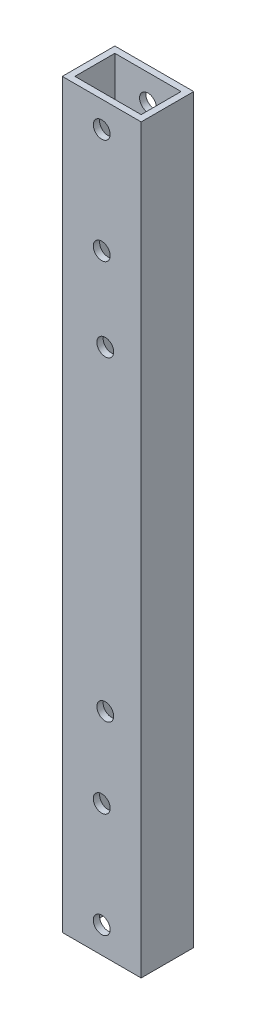
ISO-10303-21;
HEADER;
FILE_DESCRIPTION(('STEP AP214'),'2;1');
FILE_NAME('part.step','',(''),(''),'','','');
FILE_SCHEMA(('AUTOMOTIVE_DESIGN { 1 0 10303 214 1 1 1 1 }'));
ENDSEC;
DATA;
#1=APPLICATION_CONTEXT('core data for automotive mechanical design processes');
#2=APPLICATION_PROTOCOL_DEFINITION('international standard','automotive_design',2000,#1);
#3=PRODUCT_CONTEXT('',#1,'mechanical');
#4=PRODUCT('Part','Part','',(#3));
#5=PRODUCT_RELATED_PRODUCT_CATEGORY('part','',(#4));
#6=PRODUCT_DEFINITION_FORMATION('','',#4);
#7=PRODUCT_DEFINITION_CONTEXT('part definition',#1,'design');
#8=PRODUCT_DEFINITION('design','',#6,#7);
#9=PRODUCT_DEFINITION_SHAPE('','',#8);
#10=(LENGTH_UNIT() NAMED_UNIT(*) SI_UNIT(.MILLI.,.METRE.));
#11=(NAMED_UNIT(*) PLANE_ANGLE_UNIT() SI_UNIT($,.RADIAN.));
#12=(NAMED_UNIT(*) SI_UNIT($,.STERADIAN.) SOLID_ANGLE_UNIT());
#13=UNCERTAINTY_MEASURE_WITH_UNIT(LENGTH_MEASURE(1.E-05),#10,'distance_accuracy_value','');
#14=(GEOMETRIC_REPRESENTATION_CONTEXT(3) GLOBAL_UNCERTAINTY_ASSIGNED_CONTEXT((#13)) GLOBAL_UNIT_ASSIGNED_CONTEXT((#10,
#11,#12)) REPRESENTATION_CONTEXT('',''));
#15=CARTESIAN_POINT('',(0.,0.,0.));
#16=DIRECTION('',(0.,0.,1.));
#17=DIRECTION('',(1.,0.,0.));
#18=AXIS2_PLACEMENT_3D('',#15,#16,#17);
#19=CARTESIAN_POINT('',(0.,70.5,0.));
#20=DIRECTION('',(0.,1.,0.));
#21=DIRECTION('',(0.,0.,1.));
#22=AXIS2_PLACEMENT_3D('',#19,#20,#21);
#23=PLANE('',#22);
#24=DIRECTION('',(0.,0.,-1.));
#25=VECTOR('',#24,1.);
#26=CARTESIAN_POINT('',(7.5,70.5,-5.));
#27=LINE('',#26,#25);
#28=CARTESIAN_POINT('',(7.5,70.5,5.));
#29=VERTEX_POINT('',#28);
#30=CARTESIAN_POINT('',(7.5,70.5,-5.));
#31=VERTEX_POINT('',#30);
#32=EDGE_CURVE('E146',#29,#31,#27,.T.);
#33=ORIENTED_EDGE('',*,*,#32,.T.);
#34=DIRECTION('',(-1.,0.,0.));
#35=VECTOR('',#34,1.);
#36=CARTESIAN_POINT('',(-7.5,70.5,-5.));
#37=LINE('',#36,#35);
#38=CARTESIAN_POINT('',(-7.5,70.5,-5.));
#39=VERTEX_POINT('',#38);
#40=EDGE_CURVE('E149',#31,#39,#37,.T.);
#41=ORIENTED_EDGE('',*,*,#40,.T.);
#42=DIRECTION('',(0.,0.,1.));
#43=VECTOR('',#42,1.);
#44=CARTESIAN_POINT('',(-7.5,70.5,-5.));
#45=LINE('',#44,#43);
#46=CARTESIAN_POINT('',(-7.5,70.5,5.));
#47=VERTEX_POINT('',#46);
#48=EDGE_CURVE('E152',#39,#47,#45,.T.);
#49=ORIENTED_EDGE('',*,*,#48,.T.);
#50=DIRECTION('',(1.,0.,0.));
#51=VECTOR('',#50,1.);
#52=CARTESIAN_POINT('',(-7.5,70.5,5.));
#53=LINE('',#52,#51);
#54=EDGE_CURVE('E154',#47,#29,#53,.T.);
#55=ORIENTED_EDGE('',*,*,#54,.T.);
#56=EDGE_LOOP('',(#33,#41,#49,#55));
#57=FACE_BOUND('',#56,.T.);
#58=DIRECTION('',(1.,0.,0.));
#59=VECTOR('',#58,1.);
#60=CARTESIAN_POINT('',(-6.3,70.5,3.8));
#61=LINE('',#60,#59);
#62=CARTESIAN_POINT('',(-6.3,70.5,3.8));
#63=VERTEX_POINT('',#62);
#64=CARTESIAN_POINT('',(6.3,70.5,3.8));
#65=VERTEX_POINT('',#64);
#66=EDGE_CURVE('E116',#63,#65,#61,.T.);
#67=ORIENTED_EDGE('',*,*,#66,.F.);
#68=DIRECTION('',(0.,0.,1.));
#69=VECTOR('',#68,1.);
#70=CARTESIAN_POINT('',(-6.3,70.5,-3.8));
#71=LINE('',#70,#69);
#72=CARTESIAN_POINT('',(-6.3,70.5,-3.8));
#73=VERTEX_POINT('',#72);
#74=EDGE_CURVE('E108',#73,#63,#71,.T.);
#75=ORIENTED_EDGE('',*,*,#74,.F.);
#76=DIRECTION('',(-1.,0.,0.));
#77=VECTOR('',#76,1.);
#78=CARTESIAN_POINT('',(-6.3,70.5,-3.8));
#79=LINE('',#78,#77);
#80=CARTESIAN_POINT('',(6.3,70.5,-3.8));
#81=VERTEX_POINT('',#80);
#82=EDGE_CURVE('E130',#81,#73,#79,.T.);
#83=ORIENTED_EDGE('',*,*,#82,.F.);
#84=DIRECTION('',(0.,0.,-1.));
#85=VECTOR('',#84,1.);
#86=CARTESIAN_POINT('',(6.3,70.5,-3.8));
#87=LINE('',#86,#85);
#88=EDGE_CURVE('E128',#65,#81,#87,.T.);
#89=ORIENTED_EDGE('',*,*,#88,.F.);
#90=EDGE_LOOP('',(#67,#75,#83,#89));
#91=FACE_BOUND('',#90,.T.);
#92=ADVANCED_FACE('F41',(#57,#91),#23,.T.);
#93=CARTESIAN_POINT('',(0.,-70.5,0.));
#94=DIRECTION('',(0.,1.,0.));
#95=DIRECTION('',(0.,0.,1.));
#96=AXIS2_PLACEMENT_3D('',#93,#94,#95);
#97=PLANE('',#96);
#98=DIRECTION('',(0.,0.,-1.));
#99=VECTOR('',#98,1.);
#100=CARTESIAN_POINT('',(7.5,-70.5,-5.));
#101=LINE('',#100,#99);
#102=CARTESIAN_POINT('',(7.5,-70.5,5.));
#103=VERTEX_POINT('',#102);
#104=CARTESIAN_POINT('',(7.5,-70.5,-5.));
#105=VERTEX_POINT('',#104);
#106=EDGE_CURVE('E124',#103,#105,#101,.T.);
#107=ORIENTED_EDGE('',*,*,#106,.F.);
#108=DIRECTION('',(1.,0.,0.));
#109=VECTOR('',#108,1.);
#110=CARTESIAN_POINT('',(-7.5,-70.5,5.));
#111=LINE('',#110,#109);
#112=CARTESIAN_POINT('',(-7.5,-70.5,5.));
#113=VERTEX_POINT('',#112);
#114=EDGE_CURVE('E150',#113,#103,#111,.T.);
#115=ORIENTED_EDGE('',*,*,#114,.F.);
#116=DIRECTION('',(0.,0.,1.));
#117=VECTOR('',#116,1.);
#118=CARTESIAN_POINT('',(-7.5,-70.5,-5.));
#119=LINE('',#118,#117);
#120=CARTESIAN_POINT('',(-7.5,-70.5,-5.));
#121=VERTEX_POINT('',#120);
#122=EDGE_CURVE('E161',#121,#113,#119,.T.);
#123=ORIENTED_EDGE('',*,*,#122,.F.);
#124=DIRECTION('',(-1.,0.,0.));
#125=VECTOR('',#124,1.);
#126=CARTESIAN_POINT('',(-7.5,-70.5,-5.));
#127=LINE('',#126,#125);
#128=EDGE_CURVE('E159',#105,#121,#127,.T.);
#129=ORIENTED_EDGE('',*,*,#128,.F.);
#130=EDGE_LOOP('',(#107,#115,#123,#129));
#131=FACE_BOUND('',#130,.T.);
#132=DIRECTION('',(0.,0.,1.));
#133=VECTOR('',#132,1.);
#134=CARTESIAN_POINT('',(-6.3,-70.5,-3.8));
#135=LINE('',#134,#133);
#136=CARTESIAN_POINT('',(-6.3,-70.5,-3.8));
#137=VERTEX_POINT('',#136);
#138=CARTESIAN_POINT('',(-6.3,-70.5,3.8));
#139=VERTEX_POINT('',#138);
#140=EDGE_CURVE('E66',#137,#139,#135,.T.);
#141=ORIENTED_EDGE('',*,*,#140,.T.);
#142=DIRECTION('',(1.,0.,0.));
#143=VECTOR('',#142,1.);
#144=CARTESIAN_POINT('',(-6.3,-70.5,3.8));
#145=LINE('',#144,#143);
#146=CARTESIAN_POINT('',(6.3,-70.5,3.8));
#147=VERTEX_POINT('',#146);
#148=EDGE_CURVE('E123',#139,#147,#145,.T.);
#149=ORIENTED_EDGE('',*,*,#148,.T.);
#150=DIRECTION('',(0.,0.,-1.));
#151=VECTOR('',#150,1.);
#152=CARTESIAN_POINT('',(6.3,-70.5,-3.8));
#153=LINE('',#152,#151);
#154=CARTESIAN_POINT('',(6.3,-70.5,-3.8));
#155=VERTEX_POINT('',#154);
#156=EDGE_CURVE('E138',#147,#155,#153,.T.);
#157=ORIENTED_EDGE('',*,*,#156,.T.);
#158=DIRECTION('',(-1.,0.,0.));
#159=VECTOR('',#158,1.);
#160=CARTESIAN_POINT('',(-6.3,-70.5,-3.8));
#161=LINE('',#160,#159);
#162=EDGE_CURVE('E117',#155,#137,#161,.T.);
#163=ORIENTED_EDGE('',*,*,#162,.T.);
#164=EDGE_LOOP('',(#141,#149,#157,#163));
#165=FACE_BOUND('',#164,.T.);
#166=ADVANCED_FACE('F268',(#131,#165),#97,.F.);
#167=CARTESIAN_POINT('',(7.5,70.5,-5.));
#168=DIRECTION('',(-1.,0.,0.));
#169=DIRECTION('',(0.,0.,1.));
#170=AXIS2_PLACEMENT_3D('',#167,#168,#169);
#171=PLANE('',#170);
#172=ORIENTED_EDGE('',*,*,#106,.T.);
#173=DIRECTION('',(0.,-1.,0.));
#174=VECTOR('',#173,1.);
#175=CARTESIAN_POINT('',(7.5,70.5,-5.));
#176=LINE('',#175,#174);
#177=EDGE_CURVE('E11',#31,#105,#176,.T.);
#178=ORIENTED_EDGE('',*,*,#177,.F.);
#179=ORIENTED_EDGE('',*,*,#32,.F.);
#180=DIRECTION('',(0.,-1.,0.));
#181=VECTOR('',#180,1.);
#182=CARTESIAN_POINT('',(7.5,70.5,5.));
#183=LINE('',#182,#181);
#184=EDGE_CURVE('E156',#29,#103,#183,.T.);
#185=ORIENTED_EDGE('',*,*,#184,.T.);
#186=EDGE_LOOP('',(#172,#178,#179,#185));
#187=FACE_BOUND('',#186,.T.);
#188=ADVANCED_FACE('F43',(#187),#171,.F.);
#189=CARTESIAN_POINT('',(-7.5,70.5,-5.));
#190=DIRECTION('',(0.,0.,1.));
#191=DIRECTION('',(1.,0.,0.));
#192=AXIS2_PLACEMENT_3D('',#189,#190,#191);
#193=PLANE('',#192);
#194=CARTESIAN_POINT('',(0.676513703622816,-30.,-5.));
#195=DIRECTION('',(0.,0.,-1.));
#196=DIRECTION('',(-1.,0.,0.));
#197=AXIS2_PLACEMENT_3D('',#194,#195,#196);
#198=CIRCLE('',#197,1.59999999999999);
#199=CARTESIAN_POINT('',(-0.923486296377175,-30.,-5.));
#200=VERTEX_POINT('',#199);
#201=EDGE_CURVE('E199',#200,#200,#198,.T.);
#202=ORIENTED_EDGE('',*,*,#201,.F.);
#203=EDGE_LOOP('',(#202));
#204=FACE_BOUND('',#203,.T.);
#205=CARTESIAN_POINT('',(0.676513703622816,30.,-5.));
#206=DIRECTION('',(0.,0.,-1.));
#207=DIRECTION('',(-1.,0.,0.));
#208=AXIS2_PLACEMENT_3D('',#205,#206,#207);
#209=CIRCLE('',#208,1.59999999999999);
#210=CARTESIAN_POINT('',(-0.923486296377175,30.,-5.));
#211=VERTEX_POINT('',#210);
#212=EDGE_CURVE('E204',#211,#211,#209,.T.);
#213=ORIENTED_EDGE('',*,*,#212,.F.);
#214=EDGE_LOOP('',(#213));
#215=FACE_BOUND('',#214,.T.);
#216=CARTESIAN_POINT('',(0.,-65.5,-5.));
#217=DIRECTION('',(0.,0.,-1.));
#218=DIRECTION('',(-1.,0.,0.));
#219=AXIS2_PLACEMENT_3D('',#216,#217,#218);
#220=CIRCLE('',#219,1.60000000000001);
#221=CARTESIAN_POINT('',(-1.60000000000001,-65.5,-5.));
#222=VERTEX_POINT('',#221);
#223=EDGE_CURVE('E175',#222,#222,#220,.T.);
#224=ORIENTED_EDGE('',*,*,#223,.F.);
#225=EDGE_LOOP('',(#224));
#226=FACE_BOUND('',#225,.T.);
#227=CARTESIAN_POINT('',(0.,-45.5,-5.));
#228=DIRECTION('',(0.,0.,-1.));
#229=DIRECTION('',(-1.,0.,0.));
#230=AXIS2_PLACEMENT_3D('',#227,#228,#229);
#231=CIRCLE('',#230,1.6);
#232=CARTESIAN_POINT('',(-1.6,-45.5,-5.));
#233=VERTEX_POINT('',#232);
#234=EDGE_CURVE('E218',#233,#233,#231,.T.);
#235=ORIENTED_EDGE('',*,*,#234,.F.);
#236=EDGE_LOOP('',(#235));
#237=FACE_BOUND('',#236,.T.);
#238=CARTESIAN_POINT('',(0.,45.5,-5.));
#239=DIRECTION('',(0.,0.,-1.));
#240=DIRECTION('',(1.,0.,0.));
#241=AXIS2_PLACEMENT_3D('',#238,#239,#240);
#242=CIRCLE('',#241,1.6);
#243=CARTESIAN_POINT('',(1.59999999999999,45.5,-5.));
#244=VERTEX_POINT('',#243);
#245=EDGE_CURVE('E221',#244,#244,#242,.T.);
#246=ORIENTED_EDGE('',*,*,#245,.F.);
#247=EDGE_LOOP('',(#246));
#248=FACE_BOUND('',#247,.T.);
#249=CARTESIAN_POINT('',(0.,65.5,-5.));
#250=DIRECTION('',(0.,0.,-1.));
#251=DIRECTION('',(1.,0.,0.));
#252=AXIS2_PLACEMENT_3D('',#249,#250,#251);
#253=CIRCLE('',#252,1.60000000000001);
#254=CARTESIAN_POINT('',(1.6,65.5,-5.));
#255=VERTEX_POINT('',#254);
#256=EDGE_CURVE('E215',#255,#255,#253,.T.);
#257=ORIENTED_EDGE('',*,*,#256,.F.);
#258=EDGE_LOOP('',(#257));
#259=FACE_BOUND('',#258,.T.);
#260=ORIENTED_EDGE('',*,*,#128,.T.);
#261=DIRECTION('',(0.,-1.,0.));
#262=VECTOR('',#261,1.);
#263=CARTESIAN_POINT('',(-7.5,70.5,-5.));
#264=LINE('',#263,#262);
#265=EDGE_CURVE('E50',#39,#121,#264,.T.);
#266=ORIENTED_EDGE('',*,*,#265,.F.);
#267=ORIENTED_EDGE('',*,*,#40,.F.);
#268=ORIENTED_EDGE('',*,*,#177,.T.);
#269=EDGE_LOOP('',(#260,#266,#267,#268));
#270=FACE_BOUND('',#269,.T.);
#271=ADVANCED_FACE('F283',(#204,#215,#226,#237,#248,#259,#270),#193,.F.);
#272=CARTESIAN_POINT('',(-7.5,70.5,-5.));
#273=DIRECTION('',(1.,0.,0.));
#274=DIRECTION('',(0.,0.,-1.));
#275=AXIS2_PLACEMENT_3D('',#272,#273,#274);
#276=PLANE('',#275);
#277=ORIENTED_EDGE('',*,*,#122,.T.);
#278=DIRECTION('',(0.,-1.,0.));
#279=VECTOR('',#278,1.);
#280=CARTESIAN_POINT('',(-7.5,70.5,5.));
#281=LINE('',#280,#279);
#282=EDGE_CURVE('E166',#47,#113,#281,.T.);
#283=ORIENTED_EDGE('',*,*,#282,.F.);
#284=ORIENTED_EDGE('',*,*,#48,.F.);
#285=ORIENTED_EDGE('',*,*,#265,.T.);
#286=EDGE_LOOP('',(#277,#283,#284,#285));
#287=FACE_BOUND('',#286,.T.);
#288=ADVANCED_FACE('F281',(#287),#276,.F.);
#289=CARTESIAN_POINT('',(-7.5,70.5,5.));
#290=DIRECTION('',(0.,0.,-1.));
#291=DIRECTION('',(-1.,0.,0.));
#292=AXIS2_PLACEMENT_3D('',#289,#290,#291);
#293=PLANE('',#292);
#294=CARTESIAN_POINT('',(0.676513703622816,-30.,5.));
#295=DIRECTION('',(0.,0.,-1.));
#296=DIRECTION('',(-1.,0.,0.));
#297=AXIS2_PLACEMENT_3D('',#294,#295,#296);
#298=CIRCLE('',#297,1.59999999999999);
#299=CARTESIAN_POINT('',(-0.923486296377175,-30.,5.));
#300=VERTEX_POINT('',#299);
#301=EDGE_CURVE('E193',#300,#300,#298,.T.);
#302=ORIENTED_EDGE('',*,*,#301,.T.);
#303=EDGE_LOOP('',(#302));
#304=FACE_BOUND('',#303,.T.);
#305=CARTESIAN_POINT('',(0.676513703622816,30.,5.));
#306=DIRECTION('',(0.,0.,-1.));
#307=DIRECTION('',(-1.,0.,0.));
#308=AXIS2_PLACEMENT_3D('',#305,#306,#307);
#309=CIRCLE('',#308,1.59999999999999);
#310=CARTESIAN_POINT('',(-0.923486296377175,30.,5.));
#311=VERTEX_POINT('',#310);
#312=EDGE_CURVE('E209',#311,#311,#309,.T.);
#313=ORIENTED_EDGE('',*,*,#312,.T.);
#314=EDGE_LOOP('',(#313));
#315=FACE_BOUND('',#314,.T.);
#316=CARTESIAN_POINT('',(0.,-65.5,5.));
#317=DIRECTION('',(0.,0.,-1.));
#318=DIRECTION('',(-1.,0.,0.));
#319=AXIS2_PLACEMENT_3D('',#316,#317,#318);
#320=CIRCLE('',#319,1.60000000000001);
#321=CARTESIAN_POINT('',(-1.60000000000001,-65.5,5.));
#322=VERTEX_POINT('',#321);
#323=EDGE_CURVE('E136',#322,#322,#320,.T.);
#324=ORIENTED_EDGE('',*,*,#323,.T.);
#325=EDGE_LOOP('',(#324));
#326=FACE_BOUND('',#325,.T.);
#327=CARTESIAN_POINT('',(0.,-45.5,5.));
#328=DIRECTION('',(0.,0.,-1.));
#329=DIRECTION('',(-1.,0.,0.));
#330=AXIS2_PLACEMENT_3D('',#327,#328,#329);
#331=CIRCLE('',#330,1.6);
#332=CARTESIAN_POINT('',(-1.6,-45.5,5.));
#333=VERTEX_POINT('',#332);
#334=EDGE_CURVE('E189',#333,#333,#331,.T.);
#335=ORIENTED_EDGE('',*,*,#334,.T.);
#336=EDGE_LOOP('',(#335));
#337=FACE_BOUND('',#336,.T.);
#338=CARTESIAN_POINT('',(0.,45.5,5.));
#339=DIRECTION('',(0.,0.,-1.));
#340=DIRECTION('',(-1.,0.,0.));
#341=AXIS2_PLACEMENT_3D('',#338,#339,#340);
#342=CIRCLE('',#341,1.6);
#343=CARTESIAN_POINT('',(-1.6,45.5,5.));
#344=VERTEX_POINT('',#343);
#345=EDGE_CURVE('E185',#344,#344,#342,.T.);
#346=ORIENTED_EDGE('',*,*,#345,.T.);
#347=EDGE_LOOP('',(#346));
#348=FACE_BOUND('',#347,.T.);
#349=CARTESIAN_POINT('',(0.,65.5,5.));
#350=DIRECTION('',(0.,0.,-1.));
#351=DIRECTION('',(-1.,0.,0.));
#352=AXIS2_PLACEMENT_3D('',#349,#350,#351);
#353=CIRCLE('',#352,1.60000000000001);
#354=CARTESIAN_POINT('',(-1.60000000000001,65.5,5.));
#355=VERTEX_POINT('',#354);
#356=EDGE_CURVE('E180',#355,#355,#353,.T.);
#357=ORIENTED_EDGE('',*,*,#356,.T.);
#358=EDGE_LOOP('',(#357));
#359=FACE_BOUND('',#358,.T.);
#360=ORIENTED_EDGE('',*,*,#114,.T.);
#361=ORIENTED_EDGE('',*,*,#184,.F.);
#362=ORIENTED_EDGE('',*,*,#54,.F.);
#363=ORIENTED_EDGE('',*,*,#282,.T.);
#364=EDGE_LOOP('',(#360,#361,#362,#363));
#365=FACE_BOUND('',#364,.T.);
#366=ADVANCED_FACE('F242',(#304,#315,#326,#337,#348,#359,#365),#293,.F.);
#367=CARTESIAN_POINT('',(-6.3,70.5,-3.8));
#368=DIRECTION('',(1.,0.,0.));
#369=DIRECTION('',(0.,0.,-1.));
#370=AXIS2_PLACEMENT_3D('',#367,#368,#369);
#371=PLANE('',#370);
#372=ORIENTED_EDGE('',*,*,#140,.F.);
#373=DIRECTION('',(0.,-1.,0.));
#374=VECTOR('',#373,1.);
#375=CARTESIAN_POINT('',(-6.3,70.5,-3.8));
#376=LINE('',#375,#374);
#377=EDGE_CURVE('E112',#73,#137,#376,.T.);
#378=ORIENTED_EDGE('',*,*,#377,.F.);
#379=ORIENTED_EDGE('',*,*,#74,.T.);
#380=DIRECTION('',(0.,-1.,0.));
#381=VECTOR('',#380,1.);
#382=CARTESIAN_POINT('',(-6.3,70.5,3.8));
#383=LINE('',#382,#381);
#384=EDGE_CURVE('E111',#63,#139,#383,.T.);
#385=ORIENTED_EDGE('',*,*,#384,.T.);
#386=EDGE_LOOP('',(#372,#378,#379,#385));
#387=FACE_BOUND('',#386,.T.);
#388=ADVANCED_FACE('F110',(#387),#371,.T.);
#389=CARTESIAN_POINT('',(-6.3,70.5,3.8));
#390=DIRECTION('',(0.,0.,-1.));
#391=DIRECTION('',(-1.,0.,0.));
#392=AXIS2_PLACEMENT_3D('',#389,#390,#391);
#393=PLANE('',#392);
#394=CARTESIAN_POINT('',(0.676513703622816,-30.,3.8));
#395=DIRECTION('',(0.,0.,-1.));
#396=DIRECTION('',(-1.,0.,0.));
#397=AXIS2_PLACEMENT_3D('',#394,#395,#396);
#398=CIRCLE('',#397,1.59999999999999);
#399=CARTESIAN_POINT('',(-0.923486296377175,-30.,3.8));
#400=VERTEX_POINT('',#399);
#401=EDGE_CURVE('E212',#400,#400,#398,.T.);
#402=ORIENTED_EDGE('',*,*,#401,.F.);
#403=EDGE_LOOP('',(#402));
#404=FACE_BOUND('',#403,.T.);
#405=CARTESIAN_POINT('',(0.676513703622816,30.,3.8));
#406=DIRECTION('',(0.,0.,-1.));
#407=DIRECTION('',(-1.,0.,0.));
#408=AXIS2_PLACEMENT_3D('',#405,#406,#407);
#409=CIRCLE('',#408,1.59999999999999);
#410=CARTESIAN_POINT('',(-0.923486296377175,30.,3.8));
#411=VERTEX_POINT('',#410);
#412=EDGE_CURVE('E192',#411,#411,#409,.T.);
#413=ORIENTED_EDGE('',*,*,#412,.F.);
#414=EDGE_LOOP('',(#413));
#415=FACE_BOUND('',#414,.T.);
#416=CARTESIAN_POINT('',(0.,-65.5,3.8));
#417=DIRECTION('',(0.,0.,-1.));
#418=DIRECTION('',(-1.,0.,0.));
#419=AXIS2_PLACEMENT_3D('',#416,#417,#418);
#420=CIRCLE('',#419,1.60000000000001);
#421=CARTESIAN_POINT('',(-1.60000000000001,-65.5,3.8));
#422=VERTEX_POINT('',#421);
#423=EDGE_CURVE('E188',#422,#422,#420,.T.);
#424=ORIENTED_EDGE('',*,*,#423,.F.);
#425=EDGE_LOOP('',(#424));
#426=FACE_BOUND('',#425,.T.);
#427=CARTESIAN_POINT('',(0.,-45.5,3.8));
#428=DIRECTION('',(0.,0.,-1.));
#429=DIRECTION('',(-1.,0.,0.));
#430=AXIS2_PLACEMENT_3D('',#427,#428,#429);
#431=CIRCLE('',#430,1.6);
#432=CARTESIAN_POINT('',(-1.6,-45.5,3.8));
#433=VERTEX_POINT('',#432);
#434=EDGE_CURVE('E184',#433,#433,#431,.T.);
#435=ORIENTED_EDGE('',*,*,#434,.F.);
#436=EDGE_LOOP('',(#435));
#437=FACE_BOUND('',#436,.T.);
#438=CARTESIAN_POINT('',(0.,45.5,3.8));
#439=DIRECTION('',(0.,0.,-1.));
#440=DIRECTION('',(-1.,0.,0.));
#441=AXIS2_PLACEMENT_3D('',#438,#439,#440);
#442=CIRCLE('',#441,1.6);
#443=CARTESIAN_POINT('',(-1.6,45.5,3.8));
#444=VERTEX_POINT('',#443);
#445=EDGE_CURVE('E179',#444,#444,#442,.T.);
#446=ORIENTED_EDGE('',*,*,#445,.F.);
#447=EDGE_LOOP('',(#446));
#448=FACE_BOUND('',#447,.T.);
#449=CARTESIAN_POINT('',(0.,65.5,3.8));
#450=DIRECTION('',(0.,0.,-1.));
#451=DIRECTION('',(-1.,0.,0.));
#452=AXIS2_PLACEMENT_3D('',#449,#450,#451);
#453=CIRCLE('',#452,1.60000000000001);
#454=CARTESIAN_POINT('',(-1.60000000000001,65.5,3.8));
#455=VERTEX_POINT('',#454);
#456=EDGE_CURVE('E174',#455,#455,#453,.T.);
#457=ORIENTED_EDGE('',*,*,#456,.F.);
#458=EDGE_LOOP('',(#457));
#459=FACE_BOUND('',#458,.T.);
#460=ORIENTED_EDGE('',*,*,#148,.F.);
#461=ORIENTED_EDGE('',*,*,#384,.F.);
#462=ORIENTED_EDGE('',*,*,#66,.T.);
#463=DIRECTION('',(0.,-1.,0.));
#464=VECTOR('',#463,1.);
#465=CARTESIAN_POINT('',(6.3,70.5,3.8));
#466=LINE('',#465,#464);
#467=EDGE_CURVE('E125',#65,#147,#466,.T.);
#468=ORIENTED_EDGE('',*,*,#467,.T.);
#469=EDGE_LOOP('',(#460,#461,#462,#468));
#470=FACE_BOUND('',#469,.T.);
#471=ADVANCED_FACE('F120',(#404,#415,#426,#437,#448,#459,#470),#393,.T.);
#472=CARTESIAN_POINT('',(6.3,70.5,-3.8));
#473=DIRECTION('',(-1.,0.,0.));
#474=DIRECTION('',(0.,0.,1.));
#475=AXIS2_PLACEMENT_3D('',#472,#473,#474);
#476=PLANE('',#475);
#477=ORIENTED_EDGE('',*,*,#156,.F.);
#478=ORIENTED_EDGE('',*,*,#467,.F.);
#479=ORIENTED_EDGE('',*,*,#88,.T.);
#480=DIRECTION('',(0.,-1.,0.));
#481=VECTOR('',#480,1.);
#482=CARTESIAN_POINT('',(6.3,70.5,-3.8));
#483=LINE('',#482,#481);
#484=EDGE_CURVE('E58',#81,#155,#483,.T.);
#485=ORIENTED_EDGE('',*,*,#484,.T.);
#486=EDGE_LOOP('',(#477,#478,#479,#485));
#487=FACE_BOUND('',#486,.T.);
#488=ADVANCED_FACE('F318',(#487),#476,.T.);
#489=CARTESIAN_POINT('',(-6.3,70.5,-3.8));
#490=DIRECTION('',(0.,0.,1.));
#491=DIRECTION('',(1.,0.,0.));
#492=AXIS2_PLACEMENT_3D('',#489,#490,#491);
#493=PLANE('',#492);
#494=CARTESIAN_POINT('',(0.676513703622816,-30.,-3.8));
#495=DIRECTION('',(0.,0.,1.));
#496=DIRECTION('',(1.,0.,0.));
#497=AXIS2_PLACEMENT_3D('',#494,#495,#496);
#498=CIRCLE('',#497,1.59999999999999);
#499=CARTESIAN_POINT('',(2.27651370362281,-30.,-3.8));
#500=VERTEX_POINT('',#499);
#501=EDGE_CURVE('E45',#500,#500,#498,.T.);
#502=ORIENTED_EDGE('',*,*,#501,.F.);
#503=EDGE_LOOP('',(#502));
#504=FACE_BOUND('',#503,.T.);
#505=CARTESIAN_POINT('',(0.676513703622816,30.,-3.8));
#506=DIRECTION('',(0.,0.,1.));
#507=DIRECTION('',(1.,0.,0.));
#508=AXIS2_PLACEMENT_3D('',#505,#506,#507);
#509=CIRCLE('',#508,1.59999999999999);
#510=CARTESIAN_POINT('',(2.27651370362281,30.,-3.8));
#511=VERTEX_POINT('',#510);
#512=EDGE_CURVE('E190',#511,#511,#509,.T.);
#513=ORIENTED_EDGE('',*,*,#512,.F.);
#514=EDGE_LOOP('',(#513));
#515=FACE_BOUND('',#514,.T.);
#516=CARTESIAN_POINT('',(0.,-65.5,-3.8));
#517=DIRECTION('',(0.,0.,1.));
#518=DIRECTION('',(1.,0.,0.));
#519=AXIS2_PLACEMENT_3D('',#516,#517,#518);
#520=CIRCLE('',#519,1.60000000000001);
#521=CARTESIAN_POINT('',(1.6,-65.5,-3.8));
#522=VERTEX_POINT('',#521);
#523=EDGE_CURVE('E186',#522,#522,#520,.T.);
#524=ORIENTED_EDGE('',*,*,#523,.F.);
#525=EDGE_LOOP('',(#524));
#526=FACE_BOUND('',#525,.T.);
#527=CARTESIAN_POINT('',(0.,-45.5,-3.8));
#528=DIRECTION('',(0.,0.,1.));
#529=DIRECTION('',(1.,0.,0.));
#530=AXIS2_PLACEMENT_3D('',#527,#528,#529);
#531=CIRCLE('',#530,1.6);
#532=CARTESIAN_POINT('',(1.59999999999999,-45.5,-3.8));
#533=VERTEX_POINT('',#532);
#534=EDGE_CURVE('E181',#533,#533,#531,.T.);
#535=ORIENTED_EDGE('',*,*,#534,.F.);
#536=EDGE_LOOP('',(#535));
#537=FACE_BOUND('',#536,.T.);
#538=CARTESIAN_POINT('',(0.,45.5,-3.8));
#539=DIRECTION('',(0.,0.,1.));
#540=DIRECTION('',(1.,0.,0.));
#541=AXIS2_PLACEMENT_3D('',#538,#539,#540);
#542=CIRCLE('',#541,1.6);
#543=CARTESIAN_POINT('',(1.59999999999999,45.5,-3.8));
#544=VERTEX_POINT('',#543);
#545=EDGE_CURVE('E176',#544,#544,#542,.T.);
#546=ORIENTED_EDGE('',*,*,#545,.F.);
#547=EDGE_LOOP('',(#546));
#548=FACE_BOUND('',#547,.T.);
#549=CARTESIAN_POINT('',(0.,65.5,-3.8));
#550=DIRECTION('',(0.,0.,1.));
#551=DIRECTION('',(1.,0.,0.));
#552=AXIS2_PLACEMENT_3D('',#549,#550,#551);
#553=CIRCLE('',#552,1.60000000000001);
#554=CARTESIAN_POINT('',(1.6,65.5,-3.8));
#555=VERTEX_POINT('',#554);
#556=EDGE_CURVE('E171',#555,#555,#553,.T.);
#557=ORIENTED_EDGE('',*,*,#556,.F.);
#558=EDGE_LOOP('',(#557));
#559=FACE_BOUND('',#558,.T.);
#560=ORIENTED_EDGE('',*,*,#162,.F.);
#561=ORIENTED_EDGE('',*,*,#484,.F.);
#562=ORIENTED_EDGE('',*,*,#82,.T.);
#563=ORIENTED_EDGE('',*,*,#377,.T.);
#564=EDGE_LOOP('',(#560,#561,#562,#563));
#565=FACE_BOUND('',#564,.T.);
#566=ADVANCED_FACE('F315',(#504,#515,#526,#537,#548,#559,#565),#493,.T.);
#567=CARTESIAN_POINT('',(0.,65.5,95.));
#568=DIRECTION('',(0.,0.,-1.));
#569=DIRECTION('',(-1.,0.,0.));
#570=AXIS2_PLACEMENT_3D('',#567,#568,#569);
#571=CYLINDRICAL_SURFACE('',#570,1.60000000000001);
#572=ORIENTED_EDGE('',*,*,#556,.T.);
#573=EDGE_LOOP('',(#572));
#574=FACE_BOUND('',#573,.T.);
#575=ORIENTED_EDGE('',*,*,#256,.T.);
#576=EDGE_LOOP('',(#575));
#577=FACE_BOUND('',#576,.T.);
#578=ADVANCED_FACE('F317',(#574,#577),#571,.F.);
#579=CARTESIAN_POINT('',(0.,45.5,95.));
#580=DIRECTION('',(0.,0.,-1.));
#581=DIRECTION('',(-1.,0.,0.));
#582=AXIS2_PLACEMENT_3D('',#579,#580,#581);
#583=CYLINDRICAL_SURFACE('',#582,1.6);
#584=ORIENTED_EDGE('',*,*,#545,.T.);
#585=EDGE_LOOP('',(#584));
#586=FACE_BOUND('',#585,.T.);
#587=ORIENTED_EDGE('',*,*,#245,.T.);
#588=EDGE_LOOP('',(#587));
#589=FACE_BOUND('',#588,.T.);
#590=ADVANCED_FACE('F325',(#586,#589),#583,.F.);
#591=CARTESIAN_POINT('',(0.,-45.5,95.));
#592=DIRECTION('',(0.,0.,-1.));
#593=DIRECTION('',(-1.,0.,0.));
#594=AXIS2_PLACEMENT_3D('',#591,#592,#593);
#595=CYLINDRICAL_SURFACE('',#594,1.6);
#596=ORIENTED_EDGE('',*,*,#534,.T.);
#597=EDGE_LOOP('',(#596));
#598=FACE_BOUND('',#597,.T.);
#599=ORIENTED_EDGE('',*,*,#234,.T.);
#600=EDGE_LOOP('',(#599));
#601=FACE_BOUND('',#600,.T.);
#602=ADVANCED_FACE('F263',(#598,#601),#595,.F.);
#603=CARTESIAN_POINT('',(0.,-65.5,95.));
#604=DIRECTION('',(0.,0.,-1.));
#605=DIRECTION('',(-1.,0.,0.));
#606=AXIS2_PLACEMENT_3D('',#603,#604,#605);
#607=CYLINDRICAL_SURFACE('',#606,1.60000000000001);
#608=ORIENTED_EDGE('',*,*,#523,.T.);
#609=EDGE_LOOP('',(#608));
#610=FACE_BOUND('',#609,.T.);
#611=ORIENTED_EDGE('',*,*,#223,.T.);
#612=EDGE_LOOP('',(#611));
#613=FACE_BOUND('',#612,.T.);
#614=ADVANCED_FACE('F251',(#610,#613),#607,.F.);
#615=ORIENTED_EDGE('',*,*,#456,.T.);
#616=EDGE_LOOP('',(#615));
#617=FACE_BOUND('',#616,.T.);
#618=ORIENTED_EDGE('',*,*,#356,.F.);
#619=EDGE_LOOP('',(#618));
#620=FACE_BOUND('',#619,.T.);
#621=ADVANCED_FACE('F265',(#617,#620),#571,.F.);
#622=ORIENTED_EDGE('',*,*,#445,.T.);
#623=EDGE_LOOP('',(#622));
#624=FACE_BOUND('',#623,.T.);
#625=ORIENTED_EDGE('',*,*,#345,.F.);
#626=EDGE_LOOP('',(#625));
#627=FACE_BOUND('',#626,.T.);
#628=ADVANCED_FACE('F260',(#624,#627),#583,.F.);
#629=ORIENTED_EDGE('',*,*,#434,.T.);
#630=EDGE_LOOP('',(#629));
#631=FACE_BOUND('',#630,.T.);
#632=ORIENTED_EDGE('',*,*,#334,.F.);
#633=EDGE_LOOP('',(#632));
#634=FACE_BOUND('',#633,.T.);
#635=ADVANCED_FACE('F248',(#631,#634),#595,.F.);
#636=ORIENTED_EDGE('',*,*,#423,.T.);
#637=EDGE_LOOP('',(#636));
#638=FACE_BOUND('',#637,.T.);
#639=ORIENTED_EDGE('',*,*,#323,.F.);
#640=EDGE_LOOP('',(#639));
#641=FACE_BOUND('',#640,.T.);
#642=ADVANCED_FACE('F245',(#638,#641),#607,.F.);
#643=CARTESIAN_POINT('',(0.676513703622816,30.,5.));
#644=DIRECTION('',(0.,0.,-1.));
#645=DIRECTION('',(-1.,0.,0.));
#646=AXIS2_PLACEMENT_3D('',#643,#644,#645);
#647=CYLINDRICAL_SURFACE('',#646,1.59999999999999);
#648=ORIENTED_EDGE('',*,*,#512,.T.);
#649=EDGE_LOOP('',(#648));
#650=FACE_BOUND('',#649,.T.);
#651=ORIENTED_EDGE('',*,*,#212,.T.);
#652=EDGE_LOOP('',(#651));
#653=FACE_BOUND('',#652,.T.);
#654=ADVANCED_FACE('F247',(#650,#653),#647,.F.);
#655=CARTESIAN_POINT('',(0.676513703622816,-30.,5.));
#656=DIRECTION('',(0.,0.,-1.));
#657=DIRECTION('',(-1.,0.,0.));
#658=AXIS2_PLACEMENT_3D('',#655,#656,#657);
#659=CYLINDRICAL_SURFACE('',#658,1.59999999999999);
#660=ORIENTED_EDGE('',*,*,#501,.T.);
#661=EDGE_LOOP('',(#660));
#662=FACE_BOUND('',#661,.T.);
#663=ORIENTED_EDGE('',*,*,#201,.T.);
#664=EDGE_LOOP('',(#663));
#665=FACE_BOUND('',#664,.T.);
#666=ADVANCED_FACE('F257',(#662,#665),#659,.F.);
#667=ORIENTED_EDGE('',*,*,#412,.T.);
#668=EDGE_LOOP('',(#667));
#669=FACE_BOUND('',#668,.T.);
#670=ORIENTED_EDGE('',*,*,#312,.F.);
#671=EDGE_LOOP('',(#670));
#672=FACE_BOUND('',#671,.T.);
#673=ADVANCED_FACE('F259',(#669,#672),#647,.F.);
#674=ORIENTED_EDGE('',*,*,#401,.T.);
#675=EDGE_LOOP('',(#674));
#676=FACE_BOUND('',#675,.T.);
#677=ORIENTED_EDGE('',*,*,#301,.F.);
#678=EDGE_LOOP('',(#677));
#679=FACE_BOUND('',#678,.T.);
#680=ADVANCED_FACE('F408',(#676,#679),#659,.F.);
#681=CLOSED_SHELL('',(#92,#166,#188,#271,#288,#366,#388,#471,#488,#566,#578,#590,#602,#614,#621,
#628,#635,#642,#654,#666,#673,#680));
#682=MANIFOLD_SOLID_BREP('B2',#681);
#683=ADVANCED_BREP_SHAPE_REPRESENTATION('',(#18,#682),#14);
#684=SHAPE_DEFINITION_REPRESENTATION(#9,#683);
ENDSEC;
END-ISO-10303-21;
